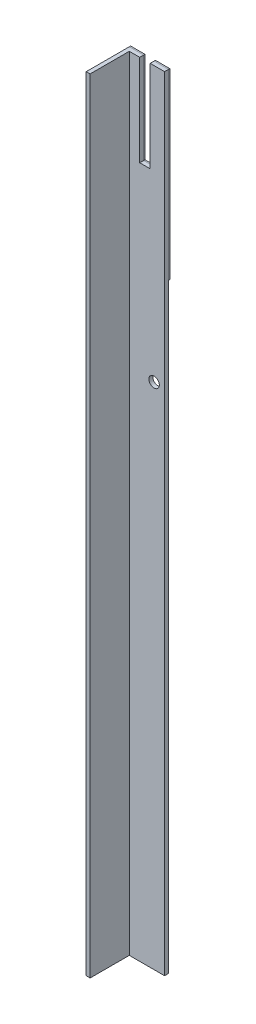
ISO-10303-21;
HEADER;
FILE_DESCRIPTION(('STEP AP214'),'2;1');
FILE_NAME('part.step','',(''),(''),'','','');
FILE_SCHEMA(('AUTOMOTIVE_DESIGN { 1 0 10303 214 1 1 1 1 }'));
ENDSEC;
DATA;
#1=APPLICATION_CONTEXT('core data for automotive mechanical design processes');
#2=APPLICATION_PROTOCOL_DEFINITION('international standard','automotive_design',2000,#1);
#3=PRODUCT_CONTEXT('',#1,'mechanical');
#4=PRODUCT('Part','Part','',(#3));
#5=PRODUCT_RELATED_PRODUCT_CATEGORY('part','',(#4));
#6=PRODUCT_DEFINITION_FORMATION('','',#4);
#7=PRODUCT_DEFINITION_CONTEXT('part definition',#1,'design');
#8=PRODUCT_DEFINITION('design','',#6,#7);
#9=PRODUCT_DEFINITION_SHAPE('','',#8);
#10=(LENGTH_UNIT() NAMED_UNIT(*) SI_UNIT(.MILLI.,.METRE.));
#11=(NAMED_UNIT(*) PLANE_ANGLE_UNIT() SI_UNIT($,.RADIAN.));
#12=(NAMED_UNIT(*) SI_UNIT($,.STERADIAN.) SOLID_ANGLE_UNIT());
#13=UNCERTAINTY_MEASURE_WITH_UNIT(LENGTH_MEASURE(1.E-05),#10,'distance_accuracy_value','');
#14=(GEOMETRIC_REPRESENTATION_CONTEXT(3) GLOBAL_UNCERTAINTY_ASSIGNED_CONTEXT((#13)) GLOBAL_UNIT_ASSIGNED_CONTEXT((#10,
#11,#12)) REPRESENTATION_CONTEXT('',''));
#15=CARTESIAN_POINT('',(0.,0.,0.));
#16=DIRECTION('',(0.,0.,1.));
#17=DIRECTION('',(1.,0.,0.));
#18=AXIS2_PLACEMENT_3D('',#15,#16,#17);
#19=CARTESIAN_POINT('',(-0.01,-0.01,33.));
#20=DIRECTION('',(0.,0.,1.));
#21=DIRECTION('',(1.,0.,0.));
#22=AXIS2_PLACEMENT_3D('',#19,#20,#21);
#23=PLANE('',#22);
#24=DIRECTION('',(1.,0.,0.));
#25=VECTOR('',#24,1.);
#26=CARTESIAN_POINT('',(5.5,600.,33.));
#27=LINE('',#26,#25);
#28=CARTESIAN_POINT('',(0.,600.,33.));
#29=VERTEX_POINT('',#28);
#30=CARTESIAN_POINT('',(3.,600.,33.));
#31=VERTEX_POINT('',#30);
#32=EDGE_CURVE('P0_E166',#29,#31,#27,.T.);
#33=ORIENTED_EDGE('',*,*,#32,.F.);
#34=DIRECTION('',(0.,1.,0.));
#35=VECTOR('',#34,1.);
#36=CARTESIAN_POINT('',(0.,300.,33.));
#37=LINE('',#36,#35);
#38=CARTESIAN_POINT('',(0.,0.,33.));
#39=VERTEX_POINT('',#38);
#40=EDGE_CURVE('P0_E108',#39,#29,#37,.T.);
#41=ORIENTED_EDGE('',*,*,#40,.F.);
#42=DIRECTION('',(-1.,0.,0.));
#43=VECTOR('',#42,1.);
#44=CARTESIAN_POINT('',(15.,0.,33.));
#45=LINE('',#44,#43);
#46=CARTESIAN_POINT('',(3.,0.,33.));
#47=VERTEX_POINT('',#46);
#48=EDGE_CURVE('P0_E92',#47,#39,#45,.T.);
#49=ORIENTED_EDGE('',*,*,#48,.F.);
#50=DIRECTION('',(0.,-1.,0.));
#51=VECTOR('',#50,1.);
#52=CARTESIAN_POINT('',(3.,300.,33.));
#53=LINE('',#52,#51);
#54=EDGE_CURVE('P0_E97',#31,#47,#53,.T.);
#55=ORIENTED_EDGE('',*,*,#54,.F.);
#56=EDGE_LOOP('',(#33,#41,#49,#55));
#57=FACE_BOUND('',#56,.T.);
#58=ADVANCED_FACE('P0_F17',(#57),#23,.T.);
#59=CARTESIAN_POINT('',(3.,-0.01,33.01));
#60=DIRECTION('',(1.,0.,0.));
#61=DIRECTION('',(0.,0.,-1.));
#62=AXIS2_PLACEMENT_3D('',#59,#60,#61);
#63=PLANE('',#62);
#64=DIRECTION('',(0.,0.,-1.));
#65=VECTOR('',#64,1.);
#66=CARTESIAN_POINT('',(3.,600.,16.5));
#67=LINE('',#66,#65);
#68=CARTESIAN_POINT('',(3.,600.,3.));
#69=VERTEX_POINT('',#68);
#70=EDGE_CURVE('P0_E102',#31,#69,#67,.T.);
#71=ORIENTED_EDGE('',*,*,#70,.F.);
#72=ORIENTED_EDGE('',*,*,#54,.T.);
#73=DIRECTION('',(0.,0.,1.));
#74=VECTOR('',#73,1.);
#75=CARTESIAN_POINT('',(3.,0.,16.5));
#76=LINE('',#75,#74);
#77=CARTESIAN_POINT('',(3.,0.,3.));
#78=VERTEX_POINT('',#77);
#79=EDGE_CURVE('P0_E100',#78,#47,#76,.T.);
#80=ORIENTED_EDGE('',*,*,#79,.F.);
#81=DIRECTION('',(0.,-1.,0.));
#82=VECTOR('',#81,1.);
#83=CARTESIAN_POINT('',(3.,300.,3.));
#84=LINE('',#83,#82);
#85=EDGE_CURVE('P0_E160',#69,#78,#84,.T.);
#86=ORIENTED_EDGE('',*,*,#85,.F.);
#87=EDGE_LOOP('',(#71,#72,#80,#86));
#88=FACE_BOUND('',#87,.T.);
#89=ADVANCED_FACE('P0_F98',(#88),#63,.T.);
#90=CARTESIAN_POINT('',(18.99,600.,-0.0100000000000011));
#91=DIRECTION('',(0.,1.,0.));
#92=DIRECTION('',(0.,0.,1.));
#93=AXIS2_PLACEMENT_3D('',#90,#91,#92);
#94=PLANE('',#93);
#95=DIRECTION('',(0.,0.,1.));
#96=VECTOR('',#95,1.);
#97=CARTESIAN_POINT('',(30.,600.,1.5));
#98=LINE('',#97,#96);
#99=CARTESIAN_POINT('',(30.,600.,0.));
#100=VERTEX_POINT('',#99);
#101=CARTESIAN_POINT('',(30.,600.,3.));
#102=VERTEX_POINT('',#101);
#103=EDGE_CURVE('P0_E106',#100,#102,#98,.T.);
#104=ORIENTED_EDGE('',*,*,#103,.F.);
#105=DIRECTION('',(1.,0.,0.));
#106=VECTOR('',#105,1.);
#107=CARTESIAN_POINT('',(15.,600.,0.));
#108=LINE('',#107,#106);
#109=CARTESIAN_POINT('',(19.,600.,0.));
#110=VERTEX_POINT('',#109);
#111=EDGE_CURVE('P0_E143',#110,#100,#108,.T.);
#112=ORIENTED_EDGE('',*,*,#111,.F.);
#113=DIRECTION('',(0.,0.,-1.));
#114=VECTOR('',#113,1.);
#115=CARTESIAN_POINT('',(19.,600.,1.5));
#116=LINE('',#115,#114);
#117=CARTESIAN_POINT('',(19.,600.,3.));
#118=VERTEX_POINT('',#117);
#119=EDGE_CURVE('P0_E149',#118,#110,#116,.T.);
#120=ORIENTED_EDGE('',*,*,#119,.F.);
#121=DIRECTION('',(-1.,0.,0.));
#122=VECTOR('',#121,1.);
#123=CARTESIAN_POINT('',(16.5,600.,3.));
#124=LINE('',#123,#122);
#125=EDGE_CURVE('P0_E154',#102,#118,#124,.T.);
#126=ORIENTED_EDGE('',*,*,#125,.F.);
#127=EDGE_LOOP('',(#104,#112,#120,#126));
#128=FACE_BOUND('',#127,.T.);
#129=ADVANCED_FACE('P0_F206',(#128),#94,.T.);
#130=CARTESIAN_POINT('',(30.,-0.01,3.01));
#131=DIRECTION('',(1.,0.,0.));
#132=DIRECTION('',(0.,0.,-1.));
#133=AXIS2_PLACEMENT_3D('',#130,#131,#132);
#134=PLANE('',#133);
#135=ORIENTED_EDGE('',*,*,#103,.T.);
#136=DIRECTION('',(0.,1.,0.));
#137=VECTOR('',#136,1.);
#138=CARTESIAN_POINT('',(30.,300.,3.));
#139=LINE('',#138,#137);
#140=CARTESIAN_POINT('',(30.,0.,3.));
#141=VERTEX_POINT('',#140);
#142=EDGE_CURVE('P0_E156',#141,#102,#139,.T.);
#143=ORIENTED_EDGE('',*,*,#142,.F.);
#144=DIRECTION('',(0.,0.,1.));
#145=VECTOR('',#144,1.);
#146=CARTESIAN_POINT('',(30.,0.,16.5));
#147=LINE('',#146,#145);
#148=CARTESIAN_POINT('',(30.,0.,0.));
#149=VERTEX_POINT('',#148);
#150=EDGE_CURVE('P0_E116',#149,#141,#147,.T.);
#151=ORIENTED_EDGE('',*,*,#150,.F.);
#152=DIRECTION('',(0.,-1.,0.));
#153=VECTOR('',#152,1.);
#154=CARTESIAN_POINT('',(30.,300.,0.));
#155=LINE('',#154,#153);
#156=EDGE_CURVE('P0_E140',#100,#149,#155,.T.);
#157=ORIENTED_EDGE('',*,*,#156,.F.);
#158=EDGE_LOOP('',(#135,#143,#151,#157));
#159=FACE_BOUND('',#158,.T.);
#160=ADVANCED_FACE('P0_F180',(#159),#134,.T.);
#161=CARTESIAN_POINT('',(30.01,0.,33.01));
#162=DIRECTION('',(0.,-1.,0.));
#163=DIRECTION('',(-1.,0.,0.));
#164=AXIS2_PLACEMENT_3D('',#161,#162,#163);
#165=PLANE('',#164);
#166=ORIENTED_EDGE('',*,*,#48,.T.);
#167=DIRECTION('',(0.,0.,1.));
#168=VECTOR('',#167,1.);
#169=CARTESIAN_POINT('',(0.,0.,16.5));
#170=LINE('',#169,#168);
#171=CARTESIAN_POINT('',(0.,0.,0.));
#172=VERTEX_POINT('',#171);
#173=EDGE_CURVE('P0_E110',#172,#39,#170,.T.);
#174=ORIENTED_EDGE('',*,*,#173,.F.);
#175=DIRECTION('',(-1.,0.,0.));
#176=VECTOR('',#175,1.);
#177=CARTESIAN_POINT('',(15.,0.,0.));
#178=LINE('',#177,#176);
#179=EDGE_CURVE('P0_E134',#149,#172,#178,.T.);
#180=ORIENTED_EDGE('',*,*,#179,.F.);
#181=ORIENTED_EDGE('',*,*,#150,.T.);
#182=DIRECTION('',(1.,0.,0.));
#183=VECTOR('',#182,1.);
#184=CARTESIAN_POINT('',(16.5,0.,3.));
#185=LINE('',#184,#183);
#186=EDGE_CURVE('P0_E114',#78,#141,#185,.T.);
#187=ORIENTED_EDGE('',*,*,#186,.F.);
#188=ORIENTED_EDGE('',*,*,#79,.T.);
#189=EDGE_LOOP('',(#166,#174,#180,#181,#187,#188));
#190=FACE_BOUND('',#189,.T.);
#191=ADVANCED_FACE('P0_F112',(#190),#165,.T.);
#192=CARTESIAN_POINT('',(0.,-0.01,-0.01));
#193=DIRECTION('',(-1.,0.,0.));
#194=DIRECTION('',(0.,0.,1.));
#195=AXIS2_PLACEMENT_3D('',#192,#193,#194);
#196=PLANE('',#195);
#197=DIRECTION('',(0.,0.,1.));
#198=VECTOR('',#197,1.);
#199=CARTESIAN_POINT('',(0.,600.,16.5));
#200=LINE('',#199,#198);
#201=CARTESIAN_POINT('',(0.,600.,0.));
#202=VERTEX_POINT('',#201);
#203=EDGE_CURVE('P0_E168',#202,#29,#200,.T.);
#204=ORIENTED_EDGE('',*,*,#203,.F.);
#205=DIRECTION('',(0.,1.,0.));
#206=VECTOR('',#205,1.);
#207=CARTESIAN_POINT('',(0.,300.,0.));
#208=LINE('',#207,#206);
#209=EDGE_CURVE('P0_E129',#172,#202,#208,.T.);
#210=ORIENTED_EDGE('',*,*,#209,.F.);
#211=ORIENTED_EDGE('',*,*,#173,.T.);
#212=ORIENTED_EDGE('',*,*,#40,.T.);
#213=EDGE_LOOP('',(#204,#210,#211,#212));
#214=FACE_BOUND('',#213,.T.);
#215=ADVANCED_FACE('P0_F173',(#214),#196,.T.);
#216=CARTESIAN_POINT('',(22.,390.,0.));
#217=DIRECTION('',(0.,0.,1.));
#218=DIRECTION('',(1.,0.,0.));
#219=AXIS2_PLACEMENT_3D('',#216,#217,#218);
#220=CYLINDRICAL_SURFACE('',#219,4.);
#221=CARTESIAN_POINT('',(22.,390.,3.));
#222=DIRECTION('',(0.,0.,1.));
#223=DIRECTION('',(1.,0.,0.));
#224=AXIS2_PLACEMENT_3D('',#221,#222,#223);
#225=CIRCLE('',#224,4.);
#226=CARTESIAN_POINT('',(26.,390.,3.));
#227=VERTEX_POINT('',#226);
#228=EDGE_CURVE('P0_E21',#227,#227,#225,.F.);
#229=ORIENTED_EDGE('',*,*,#228,.F.);
#230=EDGE_LOOP('',(#229));
#231=FACE_BOUND('',#230,.T.);
#232=CARTESIAN_POINT('',(22.,390.,0.));
#233=DIRECTION('',(0.,0.,1.));
#234=DIRECTION('',(1.,0.,0.));
#235=AXIS2_PLACEMENT_3D('',#232,#233,#234);
#236=CIRCLE('',#235,4.);
#237=CARTESIAN_POINT('',(26.,390.,0.));
#238=VERTEX_POINT('',#237);
#239=EDGE_CURVE('P0_E121',#238,#238,#236,.T.);
#240=ORIENTED_EDGE('',*,*,#239,.F.);
#241=EDGE_LOOP('',(#240));
#242=FACE_BOUND('',#241,.T.);
#243=ADVANCED_FACE('P0_F232',(#231,#242),#220,.F.);
#244=CARTESIAN_POINT('',(-0.00999999999999891,600.,-0.0100000000000011));
#245=DIRECTION('',(0.,1.,0.));
#246=DIRECTION('',(0.,0.,1.));
#247=AXIS2_PLACEMENT_3D('',#244,#245,#246);
#248=PLANE('',#247);
#249=ORIENTED_EDGE('',*,*,#70,.T.);
#250=DIRECTION('',(-1.,0.,0.));
#251=VECTOR('',#250,1.);
#252=CARTESIAN_POINT('',(16.5,600.,3.));
#253=LINE('',#252,#251);
#254=CARTESIAN_POINT('',(11.,600.,3.));
#255=VERTEX_POINT('',#254);
#256=EDGE_CURVE('P0_E162',#255,#69,#253,.T.);
#257=ORIENTED_EDGE('',*,*,#256,.F.);
#258=DIRECTION('',(0.,0.,1.));
#259=VECTOR('',#258,1.);
#260=CARTESIAN_POINT('',(11.,600.,1.5));
#261=LINE('',#260,#259);
#262=CARTESIAN_POINT('',(11.,600.,0.));
#263=VERTEX_POINT('',#262);
#264=EDGE_CURVE('P0_E188',#263,#255,#261,.T.);
#265=ORIENTED_EDGE('',*,*,#264,.F.);
#266=DIRECTION('',(1.,0.,0.));
#267=VECTOR('',#266,1.);
#268=CARTESIAN_POINT('',(15.,600.,0.));
#269=LINE('',#268,#267);
#270=EDGE_CURVE('P0_E124',#202,#263,#269,.T.);
#271=ORIENTED_EDGE('',*,*,#270,.F.);
#272=ORIENTED_EDGE('',*,*,#203,.T.);
#273=ORIENTED_EDGE('',*,*,#32,.T.);
#274=EDGE_LOOP('',(#249,#257,#265,#271,#272,#273));
#275=FACE_BOUND('',#274,.T.);
#276=ADVANCED_FACE('P0_F187',(#275),#248,.T.);
#277=CARTESIAN_POINT('',(2.99,-0.01,3.));
#278=DIRECTION('',(0.,0.,1.));
#279=DIRECTION('',(1.,0.,0.));
#280=AXIS2_PLACEMENT_3D('',#277,#278,#279);
#281=PLANE('',#280);
#282=ORIENTED_EDGE('',*,*,#228,.T.);
#283=EDGE_LOOP('',(#282));
#284=FACE_BOUND('',#283,.T.);
#285=ORIENTED_EDGE('',*,*,#142,.T.);
#286=ORIENTED_EDGE('',*,*,#125,.T.);
#287=DIRECTION('',(0.,1.,0.));
#288=VECTOR('',#287,1.);
#289=CARTESIAN_POINT('',(19.,565.,3.));
#290=LINE('',#289,#288);
#291=CARTESIAN_POINT('',(19.,530.,3.));
#292=VERTEX_POINT('',#291);
#293=EDGE_CURVE('P0_E151',#292,#118,#290,.T.);
#294=ORIENTED_EDGE('',*,*,#293,.F.);
#295=DIRECTION('',(1.,0.,0.));
#296=VECTOR('',#295,1.);
#297=CARTESIAN_POINT('',(15.,530.,3.));
#298=LINE('',#297,#296);
#299=CARTESIAN_POINT('',(11.,530.,3.));
#300=VERTEX_POINT('',#299);
#301=EDGE_CURVE('P0_E190',#300,#292,#298,.T.);
#302=ORIENTED_EDGE('',*,*,#301,.F.);
#303=DIRECTION('',(0.,-1.,0.));
#304=VECTOR('',#303,1.);
#305=CARTESIAN_POINT('',(11.,565.,3.));
#306=LINE('',#305,#304);
#307=EDGE_CURVE('P0_E123',#255,#300,#306,.T.);
#308=ORIENTED_EDGE('',*,*,#307,.F.);
#309=ORIENTED_EDGE('',*,*,#256,.T.);
#310=ORIENTED_EDGE('',*,*,#85,.T.);
#311=ORIENTED_EDGE('',*,*,#186,.T.);
#312=EDGE_LOOP('',(#285,#286,#294,#302,#308,#309,#310,#311));
#313=FACE_BOUND('',#312,.T.);
#314=ADVANCED_FACE('P0_F183',(#284,#313),#281,.T.);
#315=CARTESIAN_POINT('',(19.,600.01,-0.0100000000000011));
#316=DIRECTION('',(-1.,0.,0.));
#317=DIRECTION('',(0.,-1.,0.));
#318=AXIS2_PLACEMENT_3D('',#315,#316,#317);
#319=PLANE('',#318);
#320=DIRECTION('',(0.,1.,0.));
#321=VECTOR('',#320,1.);
#322=CARTESIAN_POINT('',(19.,300.,0.));
#323=LINE('',#322,#321);
#324=CARTESIAN_POINT('',(19.,530.,0.));
#325=VERTEX_POINT('',#324);
#326=EDGE_CURVE('P0_E146',#325,#110,#323,.T.);
#327=ORIENTED_EDGE('',*,*,#326,.F.);
#328=DIRECTION('',(0.,0.,-1.));
#329=VECTOR('',#328,1.);
#330=CARTESIAN_POINT('',(19.,530.,1.5));
#331=LINE('',#330,#329);
#332=EDGE_CURVE('P0_E197',#292,#325,#331,.T.);
#333=ORIENTED_EDGE('',*,*,#332,.F.);
#334=ORIENTED_EDGE('',*,*,#293,.T.);
#335=ORIENTED_EDGE('',*,*,#119,.T.);
#336=EDGE_LOOP('',(#327,#333,#334,#335));
#337=FACE_BOUND('',#336,.T.);
#338=ADVANCED_FACE('P0_F203',(#337),#319,.T.);
#339=CARTESIAN_POINT('',(30.01,-0.01,0.));
#340=DIRECTION('',(0.,0.,-1.));
#341=DIRECTION('',(-1.,0.,0.));
#342=AXIS2_PLACEMENT_3D('',#339,#340,#341);
#343=PLANE('',#342);
#344=ORIENTED_EDGE('',*,*,#239,.T.);
#345=EDGE_LOOP('',(#344));
#346=FACE_BOUND('',#345,.T.);
#347=DIRECTION('',(0.,1.,0.));
#348=VECTOR('',#347,1.);
#349=CARTESIAN_POINT('',(11.,565.,0.));
#350=LINE('',#349,#348);
#351=CARTESIAN_POINT('',(11.,530.,0.));
#352=VERTEX_POINT('',#351);
#353=EDGE_CURVE('P0_E36',#352,#263,#350,.T.);
#354=ORIENTED_EDGE('',*,*,#353,.F.);
#355=DIRECTION('',(-1.,0.,0.));
#356=VECTOR('',#355,1.);
#357=CARTESIAN_POINT('',(15.,530.,0.));
#358=LINE('',#357,#356);
#359=EDGE_CURVE('P0_E27',#325,#352,#358,.T.);
#360=ORIENTED_EDGE('',*,*,#359,.F.);
#361=ORIENTED_EDGE('',*,*,#326,.T.);
#362=ORIENTED_EDGE('',*,*,#111,.T.);
#363=ORIENTED_EDGE('',*,*,#156,.T.);
#364=ORIENTED_EDGE('',*,*,#179,.T.);
#365=ORIENTED_EDGE('',*,*,#209,.T.);
#366=ORIENTED_EDGE('',*,*,#270,.T.);
#367=EDGE_LOOP('',(#354,#360,#361,#362,#363,#364,#365,#366));
#368=FACE_BOUND('',#367,.T.);
#369=ADVANCED_FACE('P0_F177',(#346,#368),#343,.T.);
#370=CARTESIAN_POINT('',(11.,529.99,-0.0100000000000011));
#371=DIRECTION('',(1.,0.,0.));
#372=DIRECTION('',(0.,1.,0.));
#373=AXIS2_PLACEMENT_3D('',#370,#371,#372);
#374=PLANE('',#373);
#375=ORIENTED_EDGE('',*,*,#353,.T.);
#376=ORIENTED_EDGE('',*,*,#264,.T.);
#377=ORIENTED_EDGE('',*,*,#307,.T.);
#378=DIRECTION('',(0.,0.,1.));
#379=VECTOR('',#378,1.);
#380=CARTESIAN_POINT('',(11.,530.,1.5));
#381=LINE('',#380,#379);
#382=EDGE_CURVE('P0_E11',#352,#300,#381,.T.);
#383=ORIENTED_EDGE('',*,*,#382,.F.);
#384=EDGE_LOOP('',(#375,#376,#377,#383));
#385=FACE_BOUND('',#384,.T.);
#386=ADVANCED_FACE('P0_F192',(#385),#374,.T.);
#387=CARTESIAN_POINT('',(19.01,530.,-0.0100000000000012));
#388=DIRECTION('',(0.,1.,0.));
#389=DIRECTION('',(-1.,0.,0.));
#390=AXIS2_PLACEMENT_3D('',#387,#388,#389);
#391=PLANE('',#390);
#392=ORIENTED_EDGE('',*,*,#359,.T.);
#393=ORIENTED_EDGE('',*,*,#382,.T.);
#394=ORIENTED_EDGE('',*,*,#301,.T.);
#395=ORIENTED_EDGE('',*,*,#332,.T.);
#396=EDGE_LOOP('',(#392,#393,#394,#395));
#397=FACE_BOUND('',#396,.T.);
#398=ADVANCED_FACE('P0_F19',(#397),#391,.T.);
#399=CLOSED_SHELL('',(#58,#89,#129,#160,#191,#215,#243,#276,#314,#338,#369,#386,#398));
#400=MANIFOLD_SOLID_BREP('P0_B1',#399);
#401=CARTESIAN_POINT('',(30.01,460.,0.00999999999999819));
#402=DIRECTION('',(0.,-1.,0.));
#403=DIRECTION('',(-1.,0.,0.));
#404=AXIS2_PLACEMENT_3D('',#401,#402,#403);
#405=PLANE('',#404);
#406=DIRECTION('',(-1.,0.,0.));
#407=VECTOR('',#406,1.);
#408=CARTESIAN_POINT('',(15.,460.,-1.));
#409=LINE('',#408,#407);
#410=CARTESIAN_POINT('',(30.,460.,-1.));
#411=VERTEX_POINT('',#410);
#412=CARTESIAN_POINT('',(0.,460.,-1.));
#413=VERTEX_POINT('',#412);
#414=EDGE_CURVE('P1_E106',#411,#413,#409,.T.);
#415=ORIENTED_EDGE('',*,*,#414,.F.);
#416=DIRECTION('',(0.,0.,1.));
#417=VECTOR('',#416,1.);
#418=CARTESIAN_POINT('',(30.,460.,-0.500000000000001));
#419=LINE('',#418,#417);
#420=CARTESIAN_POINT('',(30.,460.,0.));
#421=VERTEX_POINT('',#420);
#422=EDGE_CURVE('P1_E21',#411,#421,#419,.T.);
#423=ORIENTED_EDGE('',*,*,#422,.T.);
#424=DIRECTION('',(1.,0.,0.));
#425=VECTOR('',#424,1.);
#426=CARTESIAN_POINT('',(15.,460.,0.));
#427=LINE('',#426,#425);
#428=CARTESIAN_POINT('',(0.,460.,0.));
#429=VERTEX_POINT('',#428);
#430=EDGE_CURVE('P1_E82',#429,#421,#427,.T.);
#431=ORIENTED_EDGE('',*,*,#430,.F.);
#432=DIRECTION('',(0.,0.,1.));
#433=VECTOR('',#432,1.);
#434=CARTESIAN_POINT('',(0.,460.,-0.5));
#435=LINE('',#434,#433);
#436=EDGE_CURVE('P1_E85',#413,#429,#435,.T.);
#437=ORIENTED_EDGE('',*,*,#436,.F.);
#438=EDGE_LOOP('',(#415,#423,#431,#437));
#439=FACE_BOUND('',#438,.T.);
#440=ADVANCED_FACE('P1_F17',(#439),#405,.T.);
#441=CARTESIAN_POINT('',(0.,459.99,0.01));
#442=DIRECTION('',(-1.,0.,0.));
#443=DIRECTION('',(0.,1.,0.));
#444=AXIS2_PLACEMENT_3D('',#441,#442,#443);
#445=PLANE('',#444);
#446=DIRECTION('',(0.,1.,0.));
#447=VECTOR('',#446,1.);
#448=CARTESIAN_POINT('',(0.,530.,-1.));
#449=LINE('',#448,#447);
#450=CARTESIAN_POINT('',(0.,600.,-1.));
#451=VERTEX_POINT('',#450);
#452=EDGE_CURVE('P1_E99',#413,#451,#449,.T.);
#453=ORIENTED_EDGE('',*,*,#452,.F.);
#454=ORIENTED_EDGE('',*,*,#436,.T.);
#455=DIRECTION('',(0.,-1.,0.));
#456=VECTOR('',#455,1.);
#457=CARTESIAN_POINT('',(0.,530.,0.));
#458=LINE('',#457,#456);
#459=CARTESIAN_POINT('',(0.,600.,0.));
#460=VERTEX_POINT('',#459);
#461=EDGE_CURVE('P1_E96',#460,#429,#458,.T.);
#462=ORIENTED_EDGE('',*,*,#461,.F.);
#463=DIRECTION('',(0.,0.,1.));
#464=VECTOR('',#463,1.);
#465=CARTESIAN_POINT('',(0.,600.,-0.5));
#466=LINE('',#465,#464);
#467=EDGE_CURVE('P1_E101',#451,#460,#466,.T.);
#468=ORIENTED_EDGE('',*,*,#467,.F.);
#469=EDGE_LOOP('',(#453,#454,#462,#468));
#470=FACE_BOUND('',#469,.T.);
#471=ADVANCED_FACE('P1_F95',(#470),#445,.T.);
#472=CARTESIAN_POINT('',(-0.01,600.,0.01));
#473=DIRECTION('',(0.,1.,0.));
#474=DIRECTION('',(1.,0.,0.));
#475=AXIS2_PLACEMENT_3D('',#472,#473,#474);
#476=PLANE('',#475);
#477=DIRECTION('',(1.,0.,0.));
#478=VECTOR('',#477,1.);
#479=CARTESIAN_POINT('',(15.,600.,-1.));
#480=LINE('',#479,#478);
#481=CARTESIAN_POINT('',(11.,600.,-1.));
#482=VERTEX_POINT('',#481);
#483=EDGE_CURVE('P1_E134',#451,#482,#480,.T.);
#484=ORIENTED_EDGE('',*,*,#483,.F.);
#485=ORIENTED_EDGE('',*,*,#467,.T.);
#486=DIRECTION('',(-1.,0.,0.));
#487=VECTOR('',#486,1.);
#488=CARTESIAN_POINT('',(15.,600.,0.));
#489=LINE('',#488,#487);
#490=CARTESIAN_POINT('',(11.,600.,0.));
#491=VERTEX_POINT('',#490);
#492=EDGE_CURVE('P1_E105',#491,#460,#489,.T.);
#493=ORIENTED_EDGE('',*,*,#492,.F.);
#494=DIRECTION('',(0.,0.,1.));
#495=VECTOR('',#494,1.);
#496=CARTESIAN_POINT('',(11.,600.,-0.5));
#497=LINE('',#496,#495);
#498=EDGE_CURVE('P1_E128',#482,#491,#497,.T.);
#499=ORIENTED_EDGE('',*,*,#498,.F.);
#500=EDGE_LOOP('',(#484,#485,#493,#499));
#501=FACE_BOUND('',#500,.T.);
#502=ADVANCED_FACE('P1_F132',(#501),#476,.T.);
#503=CARTESIAN_POINT('',(11.,600.01,0.00999999999999933));
#504=DIRECTION('',(1.,0.,0.));
#505=DIRECTION('',(0.,-1.,0.));
#506=AXIS2_PLACEMENT_3D('',#503,#504,#505);
#507=PLANE('',#506);
#508=DIRECTION('',(0.,-1.,0.));
#509=VECTOR('',#508,1.);
#510=CARTESIAN_POINT('',(11.,530.,-1.));
#511=LINE('',#510,#509);
#512=CARTESIAN_POINT('',(11.,530.,-1.));
#513=VERTEX_POINT('',#512);
#514=EDGE_CURVE('P1_E138',#482,#513,#511,.T.);
#515=ORIENTED_EDGE('',*,*,#514,.F.);
#516=ORIENTED_EDGE('',*,*,#498,.T.);
#517=DIRECTION('',(0.,1.,0.));
#518=VECTOR('',#517,1.);
#519=CARTESIAN_POINT('',(11.,530.,0.));
#520=LINE('',#519,#518);
#521=CARTESIAN_POINT('',(11.,530.,0.));
#522=VERTEX_POINT('',#521);
#523=EDGE_CURVE('P1_E109',#522,#491,#520,.T.);
#524=ORIENTED_EDGE('',*,*,#523,.F.);
#525=DIRECTION('',(0.,0.,1.));
#526=VECTOR('',#525,1.);
#527=CARTESIAN_POINT('',(11.,530.,-0.5));
#528=LINE('',#527,#526);
#529=EDGE_CURVE('P1_E126',#513,#522,#528,.T.);
#530=ORIENTED_EDGE('',*,*,#529,.F.);
#531=EDGE_LOOP('',(#515,#516,#524,#530));
#532=FACE_BOUND('',#531,.T.);
#533=ADVANCED_FACE('P1_F200',(#532),#507,.T.);
#534=CARTESIAN_POINT('',(10.99,530.,0.00999999999999934));
#535=DIRECTION('',(0.,1.,0.));
#536=DIRECTION('',(1.,0.,0.));
#537=AXIS2_PLACEMENT_3D('',#534,#535,#536);
#538=PLANE('',#537);
#539=DIRECTION('',(1.,0.,0.));
#540=VECTOR('',#539,1.);
#541=CARTESIAN_POINT('',(15.,530.,-1.));
#542=LINE('',#541,#540);
#543=CARTESIAN_POINT('',(19.,530.,-1.));
#544=VERTEX_POINT('',#543);
#545=EDGE_CURVE('P1_E144',#513,#544,#542,.T.);
#546=ORIENTED_EDGE('',*,*,#545,.F.);
#547=ORIENTED_EDGE('',*,*,#529,.T.);
#548=DIRECTION('',(-1.,0.,0.));
#549=VECTOR('',#548,1.);
#550=CARTESIAN_POINT('',(15.,530.,0.));
#551=LINE('',#550,#549);
#552=CARTESIAN_POINT('',(19.,530.,0.));
#553=VERTEX_POINT('',#552);
#554=EDGE_CURVE('P1_E114',#553,#522,#551,.T.);
#555=ORIENTED_EDGE('',*,*,#554,.F.);
#556=DIRECTION('',(0.,0.,1.));
#557=VECTOR('',#556,1.);
#558=CARTESIAN_POINT('',(19.,530.,-0.500000000000001));
#559=LINE('',#558,#557);
#560=EDGE_CURVE('P1_E124',#544,#553,#559,.T.);
#561=ORIENTED_EDGE('',*,*,#560,.F.);
#562=EDGE_LOOP('',(#546,#547,#555,#561));
#563=FACE_BOUND('',#562,.T.);
#564=ADVANCED_FACE('P1_F163',(#563),#538,.T.);
#565=CARTESIAN_POINT('',(19.,529.99,0.00999999999999885));
#566=DIRECTION('',(-1.,0.,0.));
#567=DIRECTION('',(0.,1.,0.));
#568=AXIS2_PLACEMENT_3D('',#565,#566,#567);
#569=PLANE('',#568);
#570=DIRECTION('',(0.,1.,0.));
#571=VECTOR('',#570,1.);
#572=CARTESIAN_POINT('',(19.,530.,-1.));
#573=LINE('',#572,#571);
#574=CARTESIAN_POINT('',(19.,600.,-1.));
#575=VERTEX_POINT('',#574);
#576=EDGE_CURVE('P1_E147',#544,#575,#573,.T.);
#577=ORIENTED_EDGE('',*,*,#576,.F.);
#578=ORIENTED_EDGE('',*,*,#560,.T.);
#579=DIRECTION('',(0.,-1.,0.));
#580=VECTOR('',#579,1.);
#581=CARTESIAN_POINT('',(19.,530.,0.));
#582=LINE('',#581,#580);
#583=CARTESIAN_POINT('',(19.,600.,0.));
#584=VERTEX_POINT('',#583);
#585=EDGE_CURVE('P1_E117',#584,#553,#582,.T.);
#586=ORIENTED_EDGE('',*,*,#585,.F.);
#587=DIRECTION('',(0.,0.,1.));
#588=VECTOR('',#587,1.);
#589=CARTESIAN_POINT('',(19.,600.,-0.500000000000001));
#590=LINE('',#589,#588);
#591=EDGE_CURVE('P1_E77',#575,#584,#590,.T.);
#592=ORIENTED_EDGE('',*,*,#591,.F.);
#593=EDGE_LOOP('',(#577,#578,#586,#592));
#594=FACE_BOUND('',#593,.T.);
#595=ADVANCED_FACE('P1_F155',(#594),#569,.T.);
#596=CARTESIAN_POINT('',(18.99,600.,0.00999999999999885));
#597=DIRECTION('',(0.,1.,0.));
#598=DIRECTION('',(1.,0.,0.));
#599=AXIS2_PLACEMENT_3D('',#596,#597,#598);
#600=PLANE('',#599);
#601=DIRECTION('',(1.,0.,0.));
#602=VECTOR('',#601,1.);
#603=CARTESIAN_POINT('',(15.,600.,-1.));
#604=LINE('',#603,#602);
#605=CARTESIAN_POINT('',(30.,600.,-1.));
#606=VERTEX_POINT('',#605);
#607=EDGE_CURVE('P1_E150',#575,#606,#604,.T.);
#608=ORIENTED_EDGE('',*,*,#607,.F.);
#609=ORIENTED_EDGE('',*,*,#591,.T.);
#610=DIRECTION('',(-1.,0.,0.));
#611=VECTOR('',#610,1.);
#612=CARTESIAN_POINT('',(15.,600.,0.));
#613=LINE('',#612,#611);
#614=CARTESIAN_POINT('',(30.,600.,0.));
#615=VERTEX_POINT('',#614);
#616=EDGE_CURVE('P1_E91',#615,#584,#613,.T.);
#617=ORIENTED_EDGE('',*,*,#616,.F.);
#618=DIRECTION('',(0.,0.,-1.));
#619=VECTOR('',#618,1.);
#620=CARTESIAN_POINT('',(30.,600.,-0.500000000000001));
#621=LINE('',#620,#619);
#622=EDGE_CURVE('P1_E36',#615,#606,#621,.T.);
#623=ORIENTED_EDGE('',*,*,#622,.T.);
#624=EDGE_LOOP('',(#608,#609,#617,#623));
#625=FACE_BOUND('',#624,.T.);
#626=ADVANCED_FACE('P1_F153',(#625),#600,.T.);
#627=CARTESIAN_POINT('',(-0.00999999999999891,459.99,0.));
#628=DIRECTION('',(0.,0.,1.));
#629=DIRECTION('',(1.,0.,0.));
#630=AXIS2_PLACEMENT_3D('',#627,#628,#629);
#631=PLANE('',#630);
#632=ORIENTED_EDGE('',*,*,#492,.T.);
#633=ORIENTED_EDGE('',*,*,#461,.T.);
#634=ORIENTED_EDGE('',*,*,#430,.T.);
#635=DIRECTION('',(0.,-1.,0.));
#636=VECTOR('',#635,1.);
#637=CARTESIAN_POINT('',(30.,530.,0.));
#638=LINE('',#637,#636);
#639=EDGE_CURVE('P1_E27',#615,#421,#638,.T.);
#640=ORIENTED_EDGE('',*,*,#639,.F.);
#641=ORIENTED_EDGE('',*,*,#616,.T.);
#642=ORIENTED_EDGE('',*,*,#585,.T.);
#643=ORIENTED_EDGE('',*,*,#554,.T.);
#644=ORIENTED_EDGE('',*,*,#523,.T.);
#645=EDGE_LOOP('',(#632,#633,#634,#640,#641,#642,#643,#644));
#646=FACE_BOUND('',#645,.T.);
#647=ADVANCED_FACE('P1_F102',(#646),#631,.T.);
#648=CARTESIAN_POINT('',(30.01,459.99,-1.));
#649=DIRECTION('',(0.,0.,-1.));
#650=DIRECTION('',(-1.,0.,0.));
#651=AXIS2_PLACEMENT_3D('',#648,#649,#650);
#652=PLANE('',#651);
#653=ORIENTED_EDGE('',*,*,#607,.T.);
#654=DIRECTION('',(0.,1.,0.));
#655=VECTOR('',#654,1.);
#656=CARTESIAN_POINT('',(30.,530.,-1.));
#657=LINE('',#656,#655);
#658=EDGE_CURVE('P1_E11',#411,#606,#657,.T.);
#659=ORIENTED_EDGE('',*,*,#658,.F.);
#660=ORIENTED_EDGE('',*,*,#414,.T.);
#661=ORIENTED_EDGE('',*,*,#452,.T.);
#662=ORIENTED_EDGE('',*,*,#483,.T.);
#663=ORIENTED_EDGE('',*,*,#514,.T.);
#664=ORIENTED_EDGE('',*,*,#545,.T.);
#665=ORIENTED_EDGE('',*,*,#576,.T.);
#666=EDGE_LOOP('',(#653,#659,#660,#661,#662,#663,#664,#665));
#667=FACE_BOUND('',#666,.T.);
#668=ADVANCED_FACE('P1_F140',(#667),#652,.T.);
#669=CARTESIAN_POINT('',(30.,600.01,0.00999999999999819));
#670=DIRECTION('',(1.,0.,0.));
#671=DIRECTION('',(0.,-1.,0.));
#672=AXIS2_PLACEMENT_3D('',#669,#670,#671);
#673=PLANE('',#672);
#674=ORIENTED_EDGE('',*,*,#658,.T.);
#675=ORIENTED_EDGE('',*,*,#622,.F.);
#676=ORIENTED_EDGE('',*,*,#639,.T.);
#677=ORIENTED_EDGE('',*,*,#422,.F.);
#678=EDGE_LOOP('',(#674,#675,#676,#677));
#679=FACE_BOUND('',#678,.T.);
#680=ADVANCED_FACE('P1_F19',(#679),#673,.T.);
#681=CLOSED_SHELL('',(#440,#471,#502,#533,#564,#595,#626,#647,#668,#680));
#682=MANIFOLD_SOLID_BREP('P1_B1',#681);
#683=ADVANCED_BREP_SHAPE_REPRESENTATION('',(#18,#400,#682),#14);
#684=SHAPE_DEFINITION_REPRESENTATION(#9,#683);
ENDSEC;
END-ISO-10303-21;
